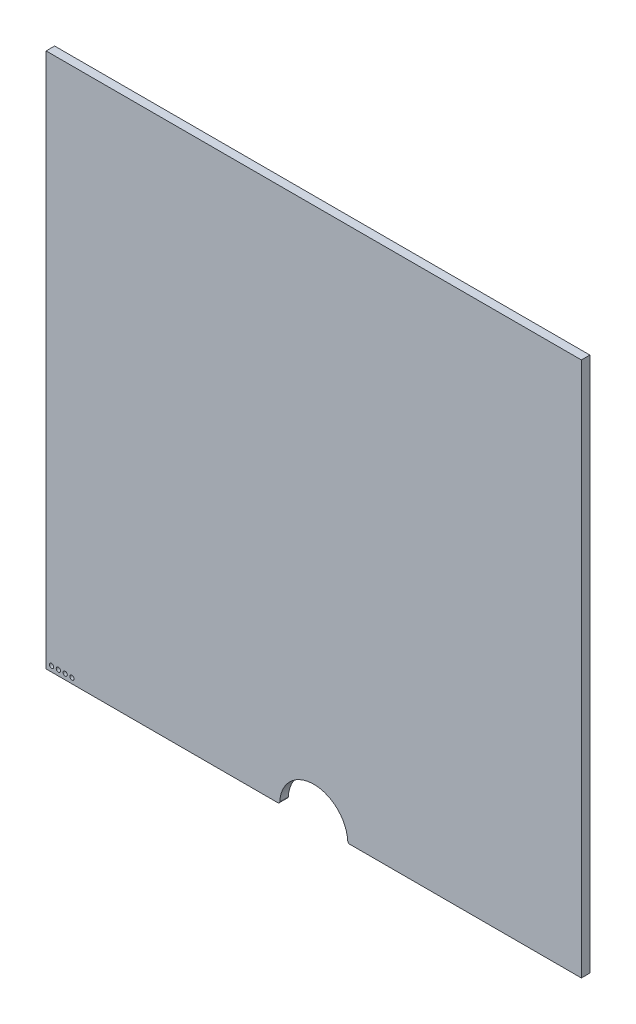
ISO-10303-21;
HEADER;
FILE_DESCRIPTION(('STEP AP214'),'2;1');
FILE_NAME('part.step','',(''),(''),'','','');
FILE_SCHEMA(('AUTOMOTIVE_DESIGN { 1 0 10303 214 1 1 1 1 }'));
ENDSEC;
DATA;
#1=APPLICATION_CONTEXT('core data for automotive mechanical design processes');
#2=APPLICATION_PROTOCOL_DEFINITION('international standard','automotive_design',2000,#1);
#3=PRODUCT_CONTEXT('',#1,'mechanical');
#4=PRODUCT('Part','Part','',(#3));
#5=PRODUCT_RELATED_PRODUCT_CATEGORY('part','',(#4));
#6=PRODUCT_DEFINITION_FORMATION('','',#4);
#7=PRODUCT_DEFINITION_CONTEXT('part definition',#1,'design');
#8=PRODUCT_DEFINITION('design','',#6,#7);
#9=PRODUCT_DEFINITION_SHAPE('','',#8);
#10=(LENGTH_UNIT() NAMED_UNIT(*) SI_UNIT(.MILLI.,.METRE.));
#11=(NAMED_UNIT(*) PLANE_ANGLE_UNIT() SI_UNIT($,.RADIAN.));
#12=(NAMED_UNIT(*) SI_UNIT($,.STERADIAN.) SOLID_ANGLE_UNIT());
#13=UNCERTAINTY_MEASURE_WITH_UNIT(LENGTH_MEASURE(1.E-05),#10,'distance_accuracy_value','');
#14=(GEOMETRIC_REPRESENTATION_CONTEXT(3) GLOBAL_UNCERTAINTY_ASSIGNED_CONTEXT((#13)) GLOBAL_UNIT_ASSIGNED_CONTEXT((#10,
#11,#12)) REPRESENTATION_CONTEXT('',''));
#15=CARTESIAN_POINT('',(0.,0.,0.));
#16=DIRECTION('',(0.,0.,1.));
#17=DIRECTION('',(1.,0.,0.));
#18=AXIS2_PLACEMENT_3D('',#15,#16,#17);
#19=CARTESIAN_POINT('',(9.7028,2.0828,1.905));
#20=DIRECTION('',(0.,0.,1.));
#21=DIRECTION('',(1.,0.,0.));
#22=AXIS2_PLACEMENT_3D('',#19,#20,#21);
#23=PLANE('',#22);
#24=CARTESIAN_POINT('',(9.7028,2.0828,1.905));
#25=DIRECTION('',(0.,0.,1.));
#26=DIRECTION('',(1.,0.,0.));
#27=AXIS2_PLACEMENT_3D('',#24,#25,#26);
#28=CIRCLE('',#27,0.79375);
#29=CARTESIAN_POINT('',(10.49655,2.0828,1.905));
#30=VERTEX_POINT('',#29);
#31=EDGE_CURVE('E11',#30,#30,#28,.T.);
#32=ORIENTED_EDGE('',*,*,#31,.T.);
#33=EDGE_LOOP('',(#32));
#34=FACE_BOUND('',#33,.T.);
#35=ADVANCED_FACE('F38',(#34),#23,.T.);
#36=CARTESIAN_POINT('',(9.7028,2.0828,1.905));
#37=DIRECTION('',(0.,0.,1.));
#38=DIRECTION('',(1.,0.,0.));
#39=AXIS2_PLACEMENT_3D('',#36,#37,#38);
#40=CYLINDRICAL_SURFACE('',#39,0.79375);
#41=ORIENTED_EDGE('',*,*,#31,.F.);
#42=EDGE_LOOP('',(#41));
#43=FACE_BOUND('',#42,.T.);
#44=CARTESIAN_POINT('',(9.7028,2.0828,3.175));
#45=DIRECTION('',(0.,0.,1.));
#46=DIRECTION('',(1.,0.,0.));
#47=AXIS2_PLACEMENT_3D('',#44,#45,#46);
#48=CIRCLE('',#47,0.79375);
#49=CARTESIAN_POINT('',(10.49655,2.0828,3.175));
#50=VERTEX_POINT('',#49);
#51=EDGE_CURVE('E45',#50,#50,#48,.T.);
#52=ORIENTED_EDGE('',*,*,#51,.T.);
#53=EDGE_LOOP('',(#52));
#54=FACE_BOUND('',#53,.T.);
#55=ADVANCED_FACE('F173',(#43,#54),#40,.F.);
#56=CARTESIAN_POINT('',(7.1628,2.0828,1.905));
#57=DIRECTION('',(0.,0.,1.));
#58=DIRECTION('',(1.,0.,0.));
#59=AXIS2_PLACEMENT_3D('',#56,#57,#58);
#60=PLANE('',#59);
#61=CARTESIAN_POINT('',(7.1628,2.0828,1.905));
#62=DIRECTION('',(0.,0.,1.));
#63=DIRECTION('',(1.,0.,0.));
#64=AXIS2_PLACEMENT_3D('',#61,#62,#63);
#65=CIRCLE('',#64,0.79375);
#66=CARTESIAN_POINT('',(7.95655,2.0828,1.905));
#67=VERTEX_POINT('',#66);
#68=EDGE_CURVE('E168',#67,#67,#65,.T.);
#69=ORIENTED_EDGE('',*,*,#68,.T.);
#70=EDGE_LOOP('',(#69));
#71=FACE_BOUND('',#70,.T.);
#72=ADVANCED_FACE('F198',(#71),#60,.T.);
#73=CARTESIAN_POINT('',(7.1628,2.0828,1.905));
#74=DIRECTION('',(0.,0.,1.));
#75=DIRECTION('',(1.,0.,0.));
#76=AXIS2_PLACEMENT_3D('',#73,#74,#75);
#77=CYLINDRICAL_SURFACE('',#76,0.79375);
#78=ORIENTED_EDGE('',*,*,#68,.F.);
#79=EDGE_LOOP('',(#78));
#80=FACE_BOUND('',#79,.T.);
#81=CARTESIAN_POINT('',(7.1628,2.0828,3.175));
#82=DIRECTION('',(0.,0.,1.));
#83=DIRECTION('',(1.,0.,0.));
#84=AXIS2_PLACEMENT_3D('',#81,#82,#83);
#85=CIRCLE('',#84,0.79375);
#86=CARTESIAN_POINT('',(7.95655,2.0828,3.175));
#87=VERTEX_POINT('',#86);
#88=EDGE_CURVE('E165',#87,#87,#85,.T.);
#89=ORIENTED_EDGE('',*,*,#88,.T.);
#90=EDGE_LOOP('',(#89));
#91=FACE_BOUND('',#90,.T.);
#92=ADVANCED_FACE('F204',(#80,#91),#77,.F.);
#93=CARTESIAN_POINT('',(0.0508,0.0508,0.));
#94=DIRECTION('',(0.,-1.,0.));
#95=DIRECTION('',(0.,0.,-1.));
#96=AXIS2_PLACEMENT_3D('',#93,#94,#95);
#97=PLANE('',#96);
#98=DIRECTION('',(1.,0.,0.));
#99=VECTOR('',#98,1.);
#100=CARTESIAN_POINT('',(0.0508,0.0508,3.175));
#101=LINE('',#100,#99);
#102=CARTESIAN_POINT('',(113.470384181604,0.0508,3.175));
#103=VERTEX_POINT('',#102);
#104=CARTESIAN_POINT('',(199.9492,0.0508,3.175));
#105=VERTEX_POINT('',#104);
#106=EDGE_CURVE('E140',#103,#105,#101,.T.);
#107=ORIENTED_EDGE('',*,*,#106,.F.);
#108=DIRECTION('',(0.,0.,-1.));
#109=VECTOR('',#108,1.);
#110=CARTESIAN_POINT('',(113.470384181604,0.0508,0.));
#111=LINE('',#110,#109);
#112=CARTESIAN_POINT('',(113.470384181604,0.0508,0.));
#113=VERTEX_POINT('',#112);
#114=EDGE_CURVE('E52',#103,#113,#111,.T.);
#115=ORIENTED_EDGE('',*,*,#114,.T.);
#116=DIRECTION('',(1.,0.,0.));
#117=VECTOR('',#116,1.);
#118=CARTESIAN_POINT('',(0.0508,0.0508,0.));
#119=LINE('',#118,#117);
#120=CARTESIAN_POINT('',(199.9492,0.0508,0.));
#121=VERTEX_POINT('',#120);
#122=EDGE_CURVE('E146',#113,#121,#119,.T.);
#123=ORIENTED_EDGE('',*,*,#122,.T.);
#124=DIRECTION('',(0.,0.,1.));
#125=VECTOR('',#124,1.);
#126=CARTESIAN_POINT('',(199.9492,0.0508,0.));
#127=LINE('',#126,#125);
#128=EDGE_CURVE('E130',#121,#105,#127,.T.);
#129=ORIENTED_EDGE('',*,*,#128,.T.);
#130=EDGE_LOOP('',(#107,#115,#123,#129));
#131=FACE_BOUND('',#130,.T.);
#132=ADVANCED_FACE('F210',(#131),#97,.T.);
#133=CARTESIAN_POINT('',(0.,0.,0.));
#134=DIRECTION('',(0.,0.,-1.));
#135=DIRECTION('',(-1.,0.,0.));
#136=AXIS2_PLACEMENT_3D('',#133,#134,#135);
#137=PLANE('',#136);
#138=CARTESIAN_POINT('',(100.,0.0508000000000002,0.));
#139=DIRECTION('',(0.,0.,1.));
#140=DIRECTION('',(1.,0.,0.));
#141=AXIS2_PLACEMENT_3D('',#138,#139,#140);
#142=CIRCLE('',#141,12.7);
#143=CARTESIAN_POINT('',(112.678008641509,0.797858823529412,0.));
#144=VERTEX_POINT('',#143);
#145=CARTESIAN_POINT('',(87.3219913584906,0.797858823529412,0.));
#146=VERTEX_POINT('',#145);
#147=EDGE_CURVE('E264',#144,#146,#142,.T.);
#148=ORIENTED_EDGE('',*,*,#147,.T.);
#149=CARTESIAN_POINT('',(86.5296158183963,0.84455,0.));
#150=DIRECTION('',(0.,0.,-1.));
#151=DIRECTION('',(-1.,0.,0.));
#152=AXIS2_PLACEMENT_3D('',#149,#150,#151);
#153=CIRCLE('',#152,0.79375);
#154=CARTESIAN_POINT('',(86.5296158183963,0.0508,0.));
#155=VERTEX_POINT('',#154);
#156=EDGE_CURVE('E162',#146,#155,#153,.T.);
#157=ORIENTED_EDGE('',*,*,#156,.T.);
#158=CARTESIAN_POINT('',(0.0508,0.0508,0.));
#159=VERTEX_POINT('',#158);
#160=EDGE_CURVE('E129',#159,#155,#119,.T.);
#161=ORIENTED_EDGE('',*,*,#160,.F.);
#162=DIRECTION('',(0.,-1.,0.));
#163=VECTOR('',#162,1.);
#164=CARTESIAN_POINT('',(0.0508,199.9492,0.));
#165=LINE('',#164,#163);
#166=CARTESIAN_POINT('',(0.0508,199.9492,0.));
#167=VERTEX_POINT('',#166);
#168=EDGE_CURVE('E109',#167,#159,#165,.T.);
#169=ORIENTED_EDGE('',*,*,#168,.F.);
#170=DIRECTION('',(-1.,0.,0.));
#171=VECTOR('',#170,1.);
#172=CARTESIAN_POINT('',(199.9492,199.9492,0.));
#173=LINE('',#172,#171);
#174=CARTESIAN_POINT('',(199.9492,199.9492,0.));
#175=VERTEX_POINT('',#174);
#176=EDGE_CURVE('E119',#175,#167,#173,.T.);
#177=ORIENTED_EDGE('',*,*,#176,.F.);
#178=DIRECTION('',(0.,1.,0.));
#179=VECTOR('',#178,1.);
#180=CARTESIAN_POINT('',(199.9492,0.0508,0.));
#181=LINE('',#180,#179);
#182=EDGE_CURVE('E125',#121,#175,#181,.T.);
#183=ORIENTED_EDGE('',*,*,#182,.F.);
#184=ORIENTED_EDGE('',*,*,#122,.F.);
#185=CARTESIAN_POINT('',(113.470384181604,0.84455,0.));
#186=DIRECTION('',(0.,0.,-1.));
#187=DIRECTION('',(-1.,0.,0.));
#188=AXIS2_PLACEMENT_3D('',#185,#186,#187);
#189=CIRCLE('',#188,0.79375);
#190=EDGE_CURVE('E160',#113,#144,#189,.T.);
#191=ORIENTED_EDGE('',*,*,#190,.T.);
#192=EDGE_LOOP('',(#148,#157,#161,#169,#177,#183,#184,#191));
#193=FACE_BOUND('',#192,.T.);
#194=ADVANCED_FACE('F127',(#193),#137,.T.);
#195=ORIENTED_EDGE('',*,*,#160,.T.);
#196=DIRECTION('',(0.,0.,-1.));
#197=VECTOR('',#196,1.);
#198=CARTESIAN_POINT('',(86.5296158183963,0.0508,3.175));
#199=LINE('',#198,#197);
#200=CARTESIAN_POINT('',(86.5296158183963,0.0508,3.175));
#201=VERTEX_POINT('',#200);
#202=EDGE_CURVE('E147',#155,#201,#199,.F.);
#203=ORIENTED_EDGE('',*,*,#202,.T.);
#204=CARTESIAN_POINT('',(0.0508,0.0508,3.175));
#205=VERTEX_POINT('',#204);
#206=EDGE_CURVE('E136',#205,#201,#101,.T.);
#207=ORIENTED_EDGE('',*,*,#206,.F.);
#208=DIRECTION('',(0.,0.,1.));
#209=VECTOR('',#208,1.);
#210=CARTESIAN_POINT('',(0.0508,0.0508,0.));
#211=LINE('',#210,#209);
#212=EDGE_CURVE('E115',#159,#205,#211,.T.);
#213=ORIENTED_EDGE('',*,*,#212,.F.);
#214=EDGE_LOOP('',(#195,#203,#207,#213));
#215=FACE_BOUND('',#214,.T.);
#216=ADVANCED_FACE('F220',(#215),#97,.T.);
#217=CARTESIAN_POINT('',(0.0508,199.9492,0.));
#218=DIRECTION('',(-1.,0.,0.));
#219=DIRECTION('',(0.,0.,1.));
#220=AXIS2_PLACEMENT_3D('',#217,#218,#219);
#221=PLANE('',#220);
#222=DIRECTION('',(0.,-1.,0.));
#223=VECTOR('',#222,1.);
#224=CARTESIAN_POINT('',(0.0508,199.9492,3.175));
#225=LINE('',#224,#223);
#226=CARTESIAN_POINT('',(0.0508,199.9492,3.175));
#227=VERTEX_POINT('',#226);
#228=EDGE_CURVE('E112',#227,#205,#225,.T.);
#229=ORIENTED_EDGE('',*,*,#228,.F.);
#230=DIRECTION('',(0.,0.,1.));
#231=VECTOR('',#230,1.);
#232=CARTESIAN_POINT('',(0.0508,199.9492,0.));
#233=LINE('',#232,#231);
#234=EDGE_CURVE('E105',#167,#227,#233,.T.);
#235=ORIENTED_EDGE('',*,*,#234,.F.);
#236=ORIENTED_EDGE('',*,*,#168,.T.);
#237=ORIENTED_EDGE('',*,*,#212,.T.);
#238=EDGE_LOOP('',(#229,#235,#236,#237));
#239=FACE_BOUND('',#238,.T.);
#240=ADVANCED_FACE('F107',(#239),#221,.T.);
#241=CARTESIAN_POINT('',(199.9492,199.9492,0.));
#242=DIRECTION('',(0.,1.,0.));
#243=DIRECTION('',(0.,0.,1.));
#244=AXIS2_PLACEMENT_3D('',#241,#242,#243);
#245=PLANE('',#244);
#246=DIRECTION('',(-1.,0.,0.));
#247=VECTOR('',#246,1.);
#248=CARTESIAN_POINT('',(199.9492,199.9492,3.175));
#249=LINE('',#248,#247);
#250=CARTESIAN_POINT('',(199.9492,199.9492,3.175));
#251=VERTEX_POINT('',#250);
#252=EDGE_CURVE('E143',#251,#227,#249,.T.);
#253=ORIENTED_EDGE('',*,*,#252,.F.);
#254=DIRECTION('',(0.,0.,1.));
#255=VECTOR('',#254,1.);
#256=CARTESIAN_POINT('',(199.9492,199.9492,0.));
#257=LINE('',#256,#255);
#258=EDGE_CURVE('E116',#175,#251,#257,.T.);
#259=ORIENTED_EDGE('',*,*,#258,.F.);
#260=ORIENTED_EDGE('',*,*,#176,.T.);
#261=ORIENTED_EDGE('',*,*,#234,.T.);
#262=EDGE_LOOP('',(#253,#259,#260,#261));
#263=FACE_BOUND('',#262,.T.);
#264=ADVANCED_FACE('F120',(#263),#245,.T.);
#265=CARTESIAN_POINT('',(199.9492,0.0508,0.));
#266=DIRECTION('',(1.,0.,0.));
#267=DIRECTION('',(0.,0.,-1.));
#268=AXIS2_PLACEMENT_3D('',#265,#266,#267);
#269=PLANE('',#268);
#270=DIRECTION('',(0.,1.,0.));
#271=VECTOR('',#270,1.);
#272=CARTESIAN_POINT('',(199.9492,0.0508,3.175));
#273=LINE('',#272,#271);
#274=EDGE_CURVE('E139',#105,#251,#273,.T.);
#275=ORIENTED_EDGE('',*,*,#274,.F.);
#276=ORIENTED_EDGE('',*,*,#128,.F.);
#277=ORIENTED_EDGE('',*,*,#182,.T.);
#278=ORIENTED_EDGE('',*,*,#258,.T.);
#279=EDGE_LOOP('',(#275,#276,#277,#278));
#280=FACE_BOUND('',#279,.T.);
#281=ADVANCED_FACE('F178',(#280),#269,.T.);
#282=CARTESIAN_POINT('',(0.,0.,3.175));
#283=DIRECTION('',(0.,0.,-1.));
#284=DIRECTION('',(-1.,0.,0.));
#285=AXIS2_PLACEMENT_3D('',#282,#283,#284);
#286=PLANE('',#285);
#287=CARTESIAN_POINT('',(4.6228,2.0828,3.175));
#288=DIRECTION('',(0.,0.,1.));
#289=DIRECTION('',(1.,0.,0.));
#290=AXIS2_PLACEMENT_3D('',#287,#288,#289);
#291=CIRCLE('',#290,0.79375);
#292=CARTESIAN_POINT('',(5.41655,2.0828,3.175));
#293=VERTEX_POINT('',#292);
#294=EDGE_CURVE('E253',#293,#293,#291,.T.);
#295=ORIENTED_EDGE('',*,*,#294,.F.);
#296=EDGE_LOOP('',(#295));
#297=FACE_BOUND('',#296,.T.);
#298=CARTESIAN_POINT('',(2.0828,2.0828,3.175));
#299=DIRECTION('',(0.,0.,1.));
#300=DIRECTION('',(1.,0.,0.));
#301=AXIS2_PLACEMENT_3D('',#298,#299,#300);
#302=CIRCLE('',#301,0.79375);
#303=CARTESIAN_POINT('',(2.87655,2.0828,3.175));
#304=VERTEX_POINT('',#303);
#305=EDGE_CURVE('E252',#304,#304,#302,.T.);
#306=ORIENTED_EDGE('',*,*,#305,.F.);
#307=EDGE_LOOP('',(#306));
#308=FACE_BOUND('',#307,.T.);
#309=ORIENTED_EDGE('',*,*,#206,.T.);
#310=CARTESIAN_POINT('',(86.5296158183963,0.84455,3.175));
#311=DIRECTION('',(0.,0.,-1.));
#312=DIRECTION('',(-1.,0.,0.));
#313=AXIS2_PLACEMENT_3D('',#310,#311,#312);
#314=CIRCLE('',#313,0.79375);
#315=CARTESIAN_POINT('',(87.3219913584906,0.797858823529412,3.175));
#316=VERTEX_POINT('',#315);
#317=EDGE_CURVE('E154',#201,#316,#314,.F.);
#318=ORIENTED_EDGE('',*,*,#317,.T.);
#319=CARTESIAN_POINT('',(100.,0.0508000000000002,3.175));
#320=DIRECTION('',(0.,0.,1.));
#321=DIRECTION('',(1.,0.,0.));
#322=AXIS2_PLACEMENT_3D('',#319,#320,#321);
#323=CIRCLE('',#322,12.7);
#324=CARTESIAN_POINT('',(112.678008641509,0.797858823529412,3.175));
#325=VERTEX_POINT('',#324);
#326=EDGE_CURVE('E262',#325,#316,#323,.T.);
#327=ORIENTED_EDGE('',*,*,#326,.F.);
#328=CARTESIAN_POINT('',(113.470384181604,0.84455,3.175));
#329=DIRECTION('',(0.,0.,-1.));
#330=DIRECTION('',(-1.,0.,0.));
#331=AXIS2_PLACEMENT_3D('',#328,#329,#330);
#332=CIRCLE('',#331,0.79375);
#333=EDGE_CURVE('E152',#325,#103,#332,.F.);
#334=ORIENTED_EDGE('',*,*,#333,.T.);
#335=ORIENTED_EDGE('',*,*,#106,.T.);
#336=ORIENTED_EDGE('',*,*,#274,.T.);
#337=ORIENTED_EDGE('',*,*,#252,.T.);
#338=ORIENTED_EDGE('',*,*,#228,.T.);
#339=EDGE_LOOP('',(#309,#318,#327,#334,#335,#336,#337,#338));
#340=FACE_BOUND('',#339,.T.);
#341=ORIENTED_EDGE('',*,*,#88,.F.);
#342=EDGE_LOOP('',(#341));
#343=FACE_BOUND('',#342,.T.);
#344=ORIENTED_EDGE('',*,*,#51,.F.);
#345=EDGE_LOOP('',(#344));
#346=FACE_BOUND('',#345,.T.);
#347=ADVANCED_FACE('F175',(#297,#308,#340,#343,#346),#286,.F.);
#348=CARTESIAN_POINT('',(100.,0.0508000000000002,0.));
#349=DIRECTION('',(0.,0.,1.));
#350=DIRECTION('',(1.,0.,0.));
#351=AXIS2_PLACEMENT_3D('',#348,#349,#350);
#352=CYLINDRICAL_SURFACE('',#351,12.7);
#353=ORIENTED_EDGE('',*,*,#326,.T.);
#354=DIRECTION('',(0.,0.,1.));
#355=VECTOR('',#354,1.);
#356=CARTESIAN_POINT('',(87.3219913584906,0.797858823529412,0.));
#357=LINE('',#356,#355);
#358=EDGE_CURVE('E60',#316,#146,#357,.F.);
#359=ORIENTED_EDGE('',*,*,#358,.T.);
#360=ORIENTED_EDGE('',*,*,#147,.F.);
#361=DIRECTION('',(0.,0.,1.));
#362=VECTOR('',#361,1.);
#363=CARTESIAN_POINT('',(112.678008641509,0.797858823529412,0.));
#364=LINE('',#363,#362);
#365=EDGE_CURVE('E156',#144,#325,#364,.T.);
#366=ORIENTED_EDGE('',*,*,#365,.T.);
#367=EDGE_LOOP('',(#353,#359,#360,#366));
#368=FACE_BOUND('',#367,.T.);
#369=ADVANCED_FACE('F177',(#368),#352,.F.);
#370=CARTESIAN_POINT('',(86.5296158183963,0.84455,0.));
#371=DIRECTION('',(0.,0.,1.));
#372=DIRECTION('',(1.,0.,0.));
#373=AXIS2_PLACEMENT_3D('',#370,#371,#372);
#374=CYLINDRICAL_SURFACE('',#373,0.79375);
#375=ORIENTED_EDGE('',*,*,#156,.F.);
#376=ORIENTED_EDGE('',*,*,#358,.F.);
#377=ORIENTED_EDGE('',*,*,#317,.F.);
#378=ORIENTED_EDGE('',*,*,#202,.F.);
#379=EDGE_LOOP('',(#375,#376,#377,#378));
#380=FACE_BOUND('',#379,.T.);
#381=ADVANCED_FACE('F185',(#380),#374,.T.);
#382=CARTESIAN_POINT('',(113.470384181604,0.84455,0.));
#383=DIRECTION('',(0.,0.,1.));
#384=DIRECTION('',(1.,0.,0.));
#385=AXIS2_PLACEMENT_3D('',#382,#383,#384);
#386=CYLINDRICAL_SURFACE('',#385,0.79375);
#387=ORIENTED_EDGE('',*,*,#190,.F.);
#388=ORIENTED_EDGE('',*,*,#114,.F.);
#389=ORIENTED_EDGE('',*,*,#333,.F.);
#390=ORIENTED_EDGE('',*,*,#365,.F.);
#391=EDGE_LOOP('',(#387,#388,#389,#390));
#392=FACE_BOUND('',#391,.T.);
#393=ADVANCED_FACE('F212',(#392),#386,.T.);
#394=CARTESIAN_POINT('',(2.0828,2.0828,1.905));
#395=DIRECTION('',(0.,0.,1.));
#396=DIRECTION('',(1.,0.,0.));
#397=AXIS2_PLACEMENT_3D('',#394,#395,#396);
#398=CYLINDRICAL_SURFACE('',#397,0.79375);
#399=CARTESIAN_POINT('',(2.0828,2.0828,1.905));
#400=DIRECTION('',(0.,0.,1.));
#401=DIRECTION('',(1.,0.,0.));
#402=AXIS2_PLACEMENT_3D('',#399,#400,#401);
#403=CIRCLE('',#402,0.79375);
#404=CARTESIAN_POINT('',(2.87655,2.0828,1.905));
#405=VERTEX_POINT('',#404);
#406=EDGE_CURVE('E256',#405,#405,#403,.T.);
#407=ORIENTED_EDGE('',*,*,#406,.F.);
#408=EDGE_LOOP('',(#407));
#409=FACE_BOUND('',#408,.T.);
#410=ORIENTED_EDGE('',*,*,#305,.T.);
#411=EDGE_LOOP('',(#410));
#412=FACE_BOUND('',#411,.T.);
#413=ADVANCED_FACE('F215',(#409,#412),#398,.F.);
#414=CARTESIAN_POINT('',(2.0828,2.0828,1.905));
#415=DIRECTION('',(0.,0.,1.));
#416=DIRECTION('',(1.,0.,0.));
#417=AXIS2_PLACEMENT_3D('',#414,#415,#416);
#418=PLANE('',#417);
#419=ORIENTED_EDGE('',*,*,#406,.T.);
#420=EDGE_LOOP('',(#419));
#421=FACE_BOUND('',#420,.T.);
#422=ADVANCED_FACE('F235',(#421),#418,.T.);
#423=CARTESIAN_POINT('',(4.6228,2.0828,1.905));
#424=DIRECTION('',(0.,0.,1.));
#425=DIRECTION('',(1.,0.,0.));
#426=AXIS2_PLACEMENT_3D('',#423,#424,#425);
#427=CYLINDRICAL_SURFACE('',#426,0.79375);
#428=CARTESIAN_POINT('',(4.6228,2.0828,1.905));
#429=DIRECTION('',(0.,0.,1.));
#430=DIRECTION('',(1.,0.,0.));
#431=AXIS2_PLACEMENT_3D('',#428,#429,#430);
#432=CIRCLE('',#431,0.79375);
#433=CARTESIAN_POINT('',(5.41655,2.0828,1.905));
#434=VERTEX_POINT('',#433);
#435=EDGE_CURVE('E251',#434,#434,#432,.T.);
#436=ORIENTED_EDGE('',*,*,#435,.F.);
#437=EDGE_LOOP('',(#436));
#438=FACE_BOUND('',#437,.T.);
#439=ORIENTED_EDGE('',*,*,#294,.T.);
#440=EDGE_LOOP('',(#439));
#441=FACE_BOUND('',#440,.T.);
#442=ADVANCED_FACE('F239',(#438,#441),#427,.F.);
#443=CARTESIAN_POINT('',(4.6228,2.0828,1.905));
#444=DIRECTION('',(0.,0.,1.));
#445=DIRECTION('',(1.,0.,0.));
#446=AXIS2_PLACEMENT_3D('',#443,#444,#445);
#447=PLANE('',#446);
#448=ORIENTED_EDGE('',*,*,#435,.T.);
#449=EDGE_LOOP('',(#448));
#450=FACE_BOUND('',#449,.T.);
#451=ADVANCED_FACE('F243',(#450),#447,.T.);
#452=CLOSED_SHELL('',(#35,#55,#72,#92,#132,#194,#216,#240,#264,#281,#347,#369,#381,#393,#413,
#422,#442,#451));
#453=MANIFOLD_SOLID_BREP('B2',#452);
#454=ADVANCED_BREP_SHAPE_REPRESENTATION('',(#18,#453),#14);
#455=SHAPE_DEFINITION_REPRESENTATION(#9,#454);
ENDSEC;
END-ISO-10303-21;
